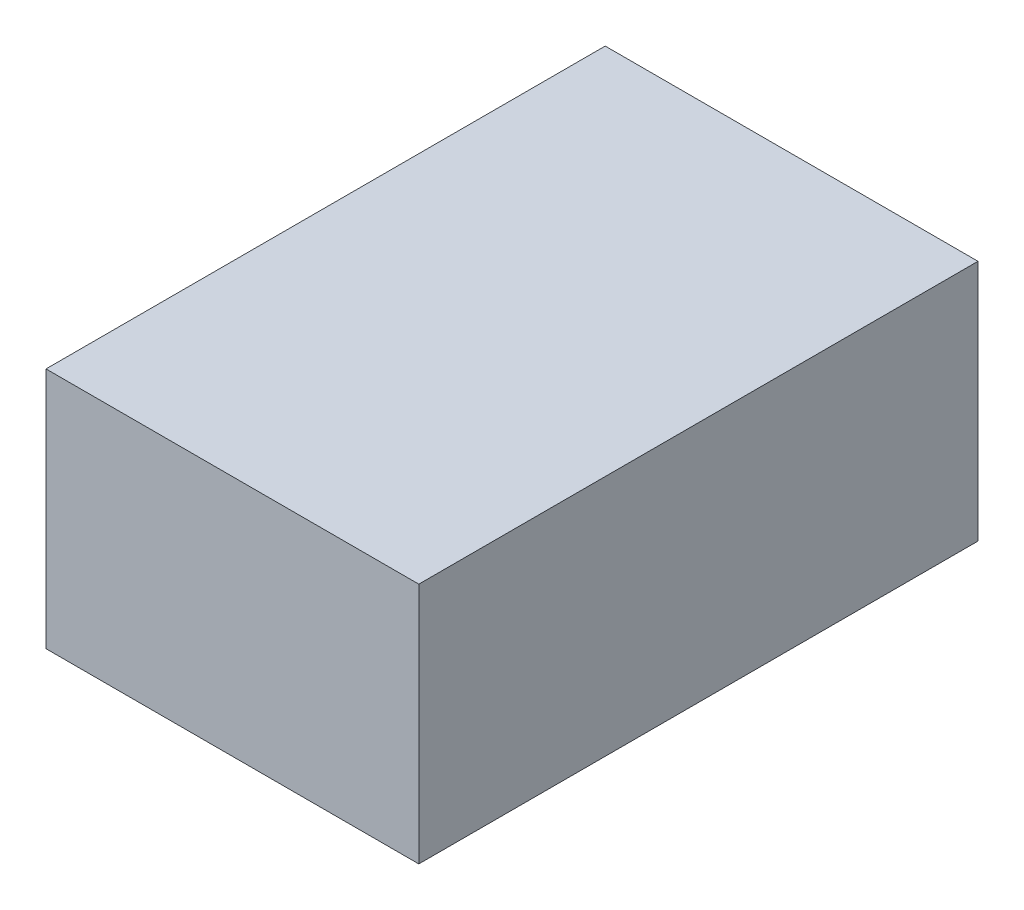
ISO-10303-21;
HEADER;
FILE_DESCRIPTION(('STEP AP214'),'2;1');
FILE_NAME('part.step','',(''),(''),'','','');
FILE_SCHEMA(('AUTOMOTIVE_DESIGN { 1 0 10303 214 1 1 1 1 }'));
ENDSEC;
DATA;
#1=APPLICATION_CONTEXT('core data for automotive mechanical design processes');
#2=APPLICATION_PROTOCOL_DEFINITION('international standard','automotive_design',2000,#1);
#3=PRODUCT_CONTEXT('',#1,'mechanical');
#4=PRODUCT('Part','Part','',(#3));
#5=PRODUCT_RELATED_PRODUCT_CATEGORY('part','',(#4));
#6=PRODUCT_DEFINITION_FORMATION('','',#4);
#7=PRODUCT_DEFINITION_CONTEXT('part definition',#1,'design');
#8=PRODUCT_DEFINITION('design','',#6,#7);
#9=PRODUCT_DEFINITION_SHAPE('','',#8);
#10=(LENGTH_UNIT() NAMED_UNIT(*) SI_UNIT(.MILLI.,.METRE.));
#11=(NAMED_UNIT(*) PLANE_ANGLE_UNIT() SI_UNIT($,.RADIAN.));
#12=(NAMED_UNIT(*) SI_UNIT($,.STERADIAN.) SOLID_ANGLE_UNIT());
#13=UNCERTAINTY_MEASURE_WITH_UNIT(LENGTH_MEASURE(1.E-05),#10,'distance_accuracy_value','');
#14=(GEOMETRIC_REPRESENTATION_CONTEXT(3) GLOBAL_UNCERTAINTY_ASSIGNED_CONTEXT((#13)) GLOBAL_UNIT_ASSIGNED_CONTEXT((#10,
#11,#12)) REPRESENTATION_CONTEXT('',''));
#15=CARTESIAN_POINT('',(0.,0.,0.));
#16=DIRECTION('',(0.,0.,1.));
#17=DIRECTION('',(1.,0.,0.));
#18=AXIS2_PLACEMENT_3D('',#15,#16,#17);
#19=CARTESIAN_POINT('',(5.,6.5,7.5));
#20=DIRECTION('',(-1.,0.,0.));
#21=DIRECTION('',(0.,0.,1.));
#22=AXIS2_PLACEMENT_3D('',#19,#20,#21);
#23=PLANE('',#22);
#24=DIRECTION('',(0.,0.,-1.));
#25=VECTOR('',#24,1.);
#26=CARTESIAN_POINT('',(5.,0.,7.5));
#27=LINE('',#26,#25);
#28=CARTESIAN_POINT('',(5.,0.,7.5));
#29=VERTEX_POINT('',#28);
#30=CARTESIAN_POINT('',(5.,0.,-7.5));
#31=VERTEX_POINT('',#30);
#32=EDGE_CURVE('E96',#29,#31,#27,.T.);
#33=ORIENTED_EDGE('',*,*,#32,.T.);
#34=DIRECTION('',(0.,-1.,0.));
#35=VECTOR('',#34,1.);
#36=CARTESIAN_POINT('',(5.,6.5,-7.5));
#37=LINE('',#36,#35);
#38=CARTESIAN_POINT('',(5.,6.5,-7.5));
#39=VERTEX_POINT('',#38);
#40=EDGE_CURVE('E11',#39,#31,#37,.T.);
#41=ORIENTED_EDGE('',*,*,#40,.F.);
#42=DIRECTION('',(0.,0.,-1.));
#43=VECTOR('',#42,1.);
#44=CARTESIAN_POINT('',(5.,6.5,7.5));
#45=LINE('',#44,#43);
#46=CARTESIAN_POINT('',(5.,6.5,7.5));
#47=VERTEX_POINT('',#46);
#48=EDGE_CURVE('E84',#47,#39,#45,.T.);
#49=ORIENTED_EDGE('',*,*,#48,.F.);
#50=DIRECTION('',(0.,-1.,0.));
#51=VECTOR('',#50,1.);
#52=CARTESIAN_POINT('',(5.,6.5,7.5));
#53=LINE('',#52,#51);
#54=EDGE_CURVE('E92',#47,#29,#53,.T.);
#55=ORIENTED_EDGE('',*,*,#54,.T.);
#56=EDGE_LOOP('',(#33,#41,#49,#55));
#57=FACE_BOUND('',#56,.T.);
#58=ADVANCED_FACE('F33',(#57),#23,.F.);
#59=CARTESIAN_POINT('',(-5.,6.5,-7.5));
#60=DIRECTION('',(0.,0.,1.));
#61=DIRECTION('',(1.,0.,0.));
#62=AXIS2_PLACEMENT_3D('',#59,#60,#61);
#63=PLANE('',#62);
#64=DIRECTION('',(-1.,0.,0.));
#65=VECTOR('',#64,1.);
#66=CARTESIAN_POINT('',(-5.,0.,-7.5));
#67=LINE('',#66,#65);
#68=CARTESIAN_POINT('',(-5.,0.,-7.5));
#69=VERTEX_POINT('',#68);
#70=EDGE_CURVE('E88',#31,#69,#67,.T.);
#71=ORIENTED_EDGE('',*,*,#70,.T.);
#72=DIRECTION('',(0.,-1.,0.));
#73=VECTOR('',#72,1.);
#74=CARTESIAN_POINT('',(-5.,6.5,-7.5));
#75=LINE('',#74,#73);
#76=CARTESIAN_POINT('',(-5.,6.5,-7.5));
#77=VERTEX_POINT('',#76);
#78=EDGE_CURVE('E41',#77,#69,#75,.T.);
#79=ORIENTED_EDGE('',*,*,#78,.F.);
#80=DIRECTION('',(-1.,0.,0.));
#81=VECTOR('',#80,1.);
#82=CARTESIAN_POINT('',(-5.,6.5,-7.5));
#83=LINE('',#82,#81);
#84=EDGE_CURVE('E79',#39,#77,#83,.T.);
#85=ORIENTED_EDGE('',*,*,#84,.F.);
#86=ORIENTED_EDGE('',*,*,#40,.T.);
#87=EDGE_LOOP('',(#71,#79,#85,#86));
#88=FACE_BOUND('',#87,.T.);
#89=ADVANCED_FACE('F87',(#88),#63,.F.);
#90=CARTESIAN_POINT('',(-5.,6.5,7.5));
#91=DIRECTION('',(1.,0.,0.));
#92=DIRECTION('',(0.,0.,-1.));
#93=AXIS2_PLACEMENT_3D('',#90,#91,#92);
#94=PLANE('',#93);
#95=DIRECTION('',(0.,0.,1.));
#96=VECTOR('',#95,1.);
#97=CARTESIAN_POINT('',(-5.,0.,7.5));
#98=LINE('',#97,#96);
#99=CARTESIAN_POINT('',(-5.,0.,7.5));
#100=VERTEX_POINT('',#99);
#101=EDGE_CURVE('E66',#69,#100,#98,.T.);
#102=ORIENTED_EDGE('',*,*,#101,.T.);
#103=DIRECTION('',(0.,-1.,0.));
#104=VECTOR('',#103,1.);
#105=CARTESIAN_POINT('',(-5.,6.5,7.5));
#106=LINE('',#105,#104);
#107=CARTESIAN_POINT('',(-5.,6.5,7.5));
#108=VERTEX_POINT('',#107);
#109=EDGE_CURVE('E89',#108,#100,#106,.T.);
#110=ORIENTED_EDGE('',*,*,#109,.F.);
#111=DIRECTION('',(0.,0.,1.));
#112=VECTOR('',#111,1.);
#113=CARTESIAN_POINT('',(-5.,6.5,7.5));
#114=LINE('',#113,#112);
#115=EDGE_CURVE('E82',#77,#108,#114,.T.);
#116=ORIENTED_EDGE('',*,*,#115,.F.);
#117=ORIENTED_EDGE('',*,*,#78,.T.);
#118=EDGE_LOOP('',(#102,#110,#116,#117));
#119=FACE_BOUND('',#118,.T.);
#120=ADVANCED_FACE('F90',(#119),#94,.F.);
#121=CARTESIAN_POINT('',(-5.,6.5,7.5));
#122=DIRECTION('',(0.,0.,-1.));
#123=DIRECTION('',(-1.,0.,0.));
#124=AXIS2_PLACEMENT_3D('',#121,#122,#123);
#125=PLANE('',#124);
#126=DIRECTION('',(1.,0.,0.));
#127=VECTOR('',#126,1.);
#128=CARTESIAN_POINT('',(-5.,0.,7.5));
#129=LINE('',#128,#127);
#130=EDGE_CURVE('E72',#100,#29,#129,.T.);
#131=ORIENTED_EDGE('',*,*,#130,.T.);
#132=ORIENTED_EDGE('',*,*,#54,.F.);
#133=DIRECTION('',(1.,0.,0.));
#134=VECTOR('',#133,1.);
#135=CARTESIAN_POINT('',(-5.,6.5,7.5));
#136=LINE('',#135,#134);
#137=EDGE_CURVE('E49',#108,#47,#136,.T.);
#138=ORIENTED_EDGE('',*,*,#137,.F.);
#139=ORIENTED_EDGE('',*,*,#109,.T.);
#140=EDGE_LOOP('',(#131,#132,#138,#139));
#141=FACE_BOUND('',#140,.T.);
#142=ADVANCED_FACE('F103',(#141),#125,.F.);
#143=CARTESIAN_POINT('',(0.,6.5,0.));
#144=DIRECTION('',(0.,-1.,0.));
#145=DIRECTION('',(0.,0.,-1.));
#146=AXIS2_PLACEMENT_3D('',#143,#144,#145);
#147=PLANE('',#146);
#148=ORIENTED_EDGE('',*,*,#48,.T.);
#149=ORIENTED_EDGE('',*,*,#84,.T.);
#150=ORIENTED_EDGE('',*,*,#115,.T.);
#151=ORIENTED_EDGE('',*,*,#137,.T.);
#152=EDGE_LOOP('',(#148,#149,#150,#151));
#153=FACE_BOUND('',#152,.T.);
#154=ADVANCED_FACE('F80',(#153),#147,.F.);
#155=CARTESIAN_POINT('',(0.,0.,0.));
#156=DIRECTION('',(0.,-1.,0.));
#157=DIRECTION('',(0.,0.,-1.));
#158=AXIS2_PLACEMENT_3D('',#155,#156,#157);
#159=PLANE('',#158);
#160=ORIENTED_EDGE('',*,*,#32,.F.);
#161=ORIENTED_EDGE('',*,*,#130,.F.);
#162=ORIENTED_EDGE('',*,*,#101,.F.);
#163=ORIENTED_EDGE('',*,*,#70,.F.);
#164=EDGE_LOOP('',(#160,#161,#162,#163));
#165=FACE_BOUND('',#164,.T.);
#166=ADVANCED_FACE('F106',(#165),#159,.T.);
#167=CLOSED_SHELL('',(#58,#89,#120,#142,#154,#166));
#168=MANIFOLD_SOLID_BREP('B2',#167);
#169=ADVANCED_BREP_SHAPE_REPRESENTATION('',(#18,#168),#14);
#170=SHAPE_DEFINITION_REPRESENTATION(#9,#169);
ENDSEC;
END-ISO-10303-21;
